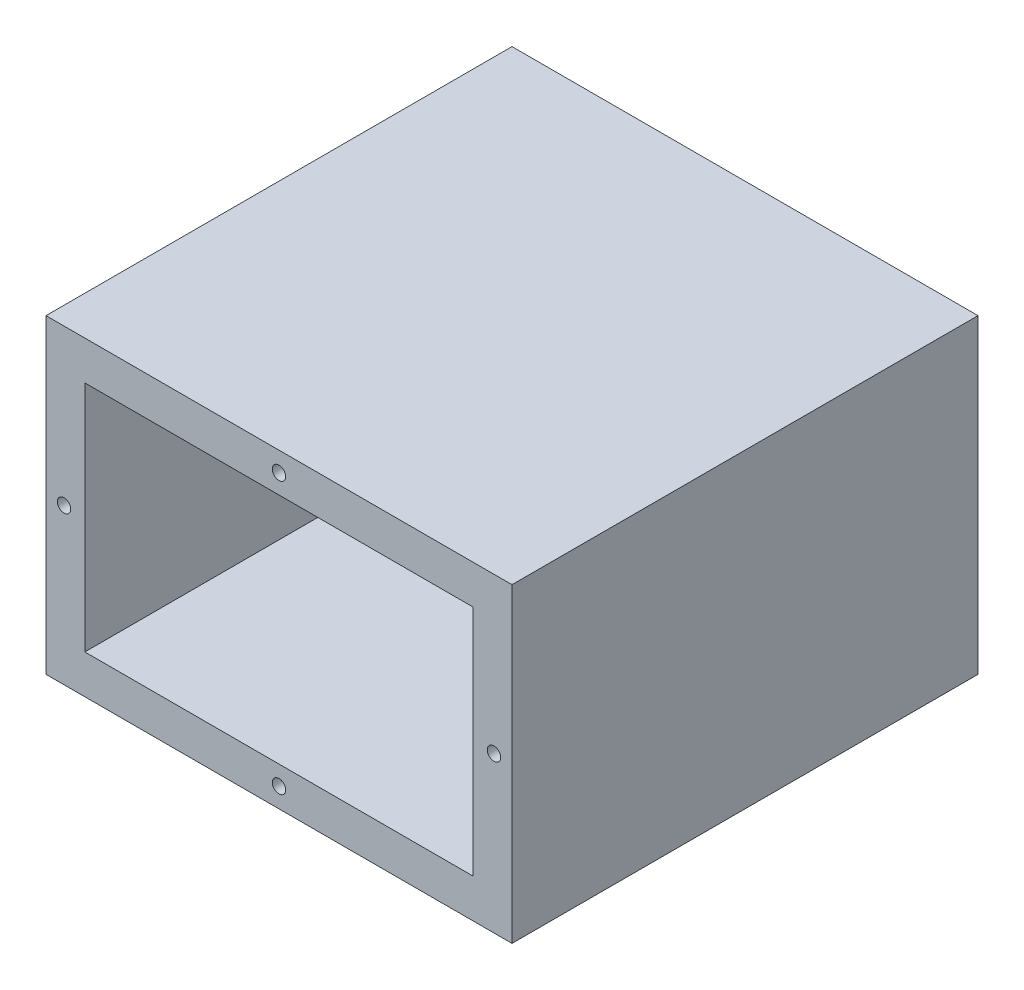
ISO-10303-21;
HEADER;
FILE_DESCRIPTION(('STEP AP214'),'2;1');
FILE_NAME('part.step','',(''),(''),'','','');
FILE_SCHEMA(('AUTOMOTIVE_DESIGN { 1 0 10303 214 1 1 1 1 }'));
ENDSEC;
DATA;
#1=APPLICATION_CONTEXT('core data for automotive mechanical design processes');
#2=APPLICATION_PROTOCOL_DEFINITION('international standard','automotive_design',2000,#1);
#3=PRODUCT_CONTEXT('',#1,'mechanical');
#4=PRODUCT('Part','Part','',(#3));
#5=PRODUCT_RELATED_PRODUCT_CATEGORY('part','',(#4));
#6=PRODUCT_DEFINITION_FORMATION('','',#4);
#7=PRODUCT_DEFINITION_CONTEXT('part definition',#1,'design');
#8=PRODUCT_DEFINITION('design','',#6,#7);
#9=PRODUCT_DEFINITION_SHAPE('','',#8);
#10=(LENGTH_UNIT() NAMED_UNIT(*) SI_UNIT(.MILLI.,.METRE.));
#11=(NAMED_UNIT(*) PLANE_ANGLE_UNIT() SI_UNIT($,.RADIAN.));
#12=(NAMED_UNIT(*) SI_UNIT($,.STERADIAN.) SOLID_ANGLE_UNIT());
#13=UNCERTAINTY_MEASURE_WITH_UNIT(LENGTH_MEASURE(1.E-05),#10,'distance_accuracy_value','');
#14=(GEOMETRIC_REPRESENTATION_CONTEXT(3) GLOBAL_UNCERTAINTY_ASSIGNED_CONTEXT((#13)) GLOBAL_UNIT_ASSIGNED_CONTEXT((#10,
#11,#12)) REPRESENTATION_CONTEXT('',''));
#15=CARTESIAN_POINT('',(0.,0.,0.));
#16=DIRECTION('',(0.,0.,1.));
#17=DIRECTION('',(1.,0.,0.));
#18=AXIS2_PLACEMENT_3D('',#15,#16,#17);
#19=CARTESIAN_POINT('',(-38.1,-25.4,76.2));
#20=DIRECTION('',(1.,0.,0.));
#21=DIRECTION('',(0.,0.,-1.));
#22=AXIS2_PLACEMENT_3D('',#19,#20,#21);
#23=PLANE('',#22);
#24=DIRECTION('',(0.,-1.,0.));
#25=VECTOR('',#24,1.);
#26=CARTESIAN_POINT('',(-38.1,-25.4,0.));
#27=LINE('',#26,#25);
#28=CARTESIAN_POINT('',(-38.1,25.4,0.));
#29=VERTEX_POINT('',#28);
#30=CARTESIAN_POINT('',(-38.1,-25.4,0.));
#31=VERTEX_POINT('',#30);
#32=EDGE_CURVE('E166',#29,#31,#27,.T.);
#33=ORIENTED_EDGE('',*,*,#32,.T.);
#34=DIRECTION('',(0.,0.,-1.));
#35=VECTOR('',#34,1.);
#36=CARTESIAN_POINT('',(-38.1,-25.4,76.2));
#37=LINE('',#36,#35);
#38=CARTESIAN_POINT('',(-38.1,-25.4,76.2));
#39=VERTEX_POINT('',#38);
#40=EDGE_CURVE('E11',#39,#31,#37,.T.);
#41=ORIENTED_EDGE('',*,*,#40,.F.);
#42=DIRECTION('',(0.,-1.,0.));
#43=VECTOR('',#42,1.);
#44=CARTESIAN_POINT('',(-38.1,-25.4,76.2));
#45=LINE('',#44,#43);
#46=CARTESIAN_POINT('',(-38.1,25.4,76.2));
#47=VERTEX_POINT('',#46);
#48=EDGE_CURVE('E175',#47,#39,#45,.T.);
#49=ORIENTED_EDGE('',*,*,#48,.F.);
#50=DIRECTION('',(0.,0.,-1.));
#51=VECTOR('',#50,1.);
#52=CARTESIAN_POINT('',(-38.1,25.4,76.2));
#53=LINE('',#52,#51);
#54=EDGE_CURVE('E183',#47,#29,#53,.T.);
#55=ORIENTED_EDGE('',*,*,#54,.T.);
#56=EDGE_LOOP('',(#33,#41,#49,#55));
#57=FACE_BOUND('',#56,.T.);
#58=ADVANCED_FACE('F44',(#57),#23,.F.);
#59=CARTESIAN_POINT('',(38.1,-25.4,76.2));
#60=DIRECTION('',(0.,1.,0.));
#61=DIRECTION('',(-1.,0.,0.));
#62=AXIS2_PLACEMENT_3D('',#59,#60,#61);
#63=PLANE('',#62);
#64=DIRECTION('',(1.,0.,0.));
#65=VECTOR('',#64,1.);
#66=CARTESIAN_POINT('',(38.1,-25.4,0.));
#67=LINE('',#66,#65);
#68=CARTESIAN_POINT('',(38.1,-25.4,0.));
#69=VERTEX_POINT('',#68);
#70=EDGE_CURVE('E188',#31,#69,#67,.T.);
#71=ORIENTED_EDGE('',*,*,#70,.T.);
#72=DIRECTION('',(0.,0.,-1.));
#73=VECTOR('',#72,1.);
#74=CARTESIAN_POINT('',(38.1,-25.4,76.2));
#75=LINE('',#74,#73);
#76=CARTESIAN_POINT('',(38.1,-25.4,76.2));
#77=VERTEX_POINT('',#76);
#78=EDGE_CURVE('E53',#77,#69,#75,.T.);
#79=ORIENTED_EDGE('',*,*,#78,.F.);
#80=DIRECTION('',(1.,0.,0.));
#81=VECTOR('',#80,1.);
#82=CARTESIAN_POINT('',(38.1,-25.4,76.2));
#83=LINE('',#82,#81);
#84=EDGE_CURVE('E97',#39,#77,#83,.T.);
#85=ORIENTED_EDGE('',*,*,#84,.F.);
#86=ORIENTED_EDGE('',*,*,#40,.T.);
#87=EDGE_LOOP('',(#71,#79,#85,#86));
#88=FACE_BOUND('',#87,.T.);
#89=ADVANCED_FACE('F279',(#88),#63,.F.);
#90=CARTESIAN_POINT('',(38.1,-25.4,76.2));
#91=DIRECTION('',(-1.,0.,0.));
#92=DIRECTION('',(0.,0.,1.));
#93=AXIS2_PLACEMENT_3D('',#90,#91,#92);
#94=PLANE('',#93);
#95=DIRECTION('',(0.,1.,0.));
#96=VECTOR('',#95,1.);
#97=CARTESIAN_POINT('',(38.1,-25.4,0.));
#98=LINE('',#97,#96);
#99=CARTESIAN_POINT('',(38.1,25.4,0.));
#100=VERTEX_POINT('',#99);
#101=EDGE_CURVE('E194',#69,#100,#98,.T.);
#102=ORIENTED_EDGE('',*,*,#101,.T.);
#103=DIRECTION('',(0.,0.,-1.));
#104=VECTOR('',#103,1.);
#105=CARTESIAN_POINT('',(38.1,25.4,76.2));
#106=LINE('',#105,#104);
#107=CARTESIAN_POINT('',(38.1,25.4,76.2));
#108=VERTEX_POINT('',#107);
#109=EDGE_CURVE('E200',#108,#100,#106,.T.);
#110=ORIENTED_EDGE('',*,*,#109,.F.);
#111=DIRECTION('',(0.,1.,0.));
#112=VECTOR('',#111,1.);
#113=CARTESIAN_POINT('',(38.1,-25.4,76.2));
#114=LINE('',#113,#112);
#115=EDGE_CURVE('E178',#77,#108,#114,.T.);
#116=ORIENTED_EDGE('',*,*,#115,.F.);
#117=ORIENTED_EDGE('',*,*,#78,.T.);
#118=EDGE_LOOP('',(#102,#110,#116,#117));
#119=FACE_BOUND('',#118,.T.);
#120=ADVANCED_FACE('F284',(#119),#94,.F.);
#121=CARTESIAN_POINT('',(38.1,25.4,76.2));
#122=DIRECTION('',(0.,-1.,0.));
#123=DIRECTION('',(1.,0.,0.));
#124=AXIS2_PLACEMENT_3D('',#121,#122,#123);
#125=PLANE('',#124);
#126=DIRECTION('',(-1.,0.,0.));
#127=VECTOR('',#126,1.);
#128=CARTESIAN_POINT('',(38.1,25.4,0.));
#129=LINE('',#128,#127);
#130=EDGE_CURVE('E95',#100,#29,#129,.T.);
#131=ORIENTED_EDGE('',*,*,#130,.T.);
#132=ORIENTED_EDGE('',*,*,#54,.F.);
#133=DIRECTION('',(-1.,0.,0.));
#134=VECTOR('',#133,1.);
#135=CARTESIAN_POINT('',(38.1,25.4,76.2));
#136=LINE('',#135,#134);
#137=EDGE_CURVE('E72',#108,#47,#136,.T.);
#138=ORIENTED_EDGE('',*,*,#137,.F.);
#139=ORIENTED_EDGE('',*,*,#109,.T.);
#140=EDGE_LOOP('',(#131,#132,#138,#139));
#141=FACE_BOUND('',#140,.T.);
#142=ADVANCED_FACE('F264',(#141),#125,.F.);
#143=CARTESIAN_POINT('',(0.,0.,76.2));
#144=DIRECTION('',(0.,0.,1.));
#145=DIRECTION('',(1.,0.,0.));
#146=AXIS2_PLACEMENT_3D('',#143,#144,#145);
#147=PLANE('',#146);
#148=CARTESIAN_POINT('',(-35.1498353727456,0.,76.2));
#149=DIRECTION('',(0.,0.,1.));
#150=DIRECTION('',(1.,0.,0.));
#151=AXIS2_PLACEMENT_3D('',#148,#149,#150);
#152=CIRCLE('',#151,1.0922);
#153=CARTESIAN_POINT('',(-34.0576353727456,0.,76.2));
#154=VERTEX_POINT('',#153);
#155=EDGE_CURVE('E243',#154,#154,#152,.T.);
#156=ORIENTED_EDGE('',*,*,#155,.F.);
#157=EDGE_LOOP('',(#156));
#158=FACE_BOUND('',#157,.T.);
#159=CARTESIAN_POINT('',(35.1498353727456,0.,76.2));
#160=DIRECTION('',(0.,0.,1.));
#161=DIRECTION('',(-1.,0.,0.));
#162=AXIS2_PLACEMENT_3D('',#159,#160,#161);
#163=CIRCLE('',#162,1.0922);
#164=CARTESIAN_POINT('',(34.0576353727456,0.,76.2));
#165=VERTEX_POINT('',#164);
#166=EDGE_CURVE('E238',#165,#165,#163,.T.);
#167=ORIENTED_EDGE('',*,*,#166,.F.);
#168=EDGE_LOOP('',(#167));
#169=FACE_BOUND('',#168,.T.);
#170=CARTESIAN_POINT('',(0.,22.1865179883757,76.2));
#171=DIRECTION('',(0.,0.,1.));
#172=DIRECTION('',(1.,0.,0.));
#173=AXIS2_PLACEMENT_3D('',#170,#171,#172);
#174=CIRCLE('',#173,1.0922);
#175=CARTESIAN_POINT('',(1.09220000000001,22.1865179883757,76.2));
#176=VERTEX_POINT('',#175);
#177=EDGE_CURVE('E234',#176,#176,#174,.T.);
#178=ORIENTED_EDGE('',*,*,#177,.F.);
#179=EDGE_LOOP('',(#178));
#180=FACE_BOUND('',#179,.T.);
#181=CARTESIAN_POINT('',(0.,-22.1865179883758,76.2));
#182=DIRECTION('',(0.,0.,1.));
#183=DIRECTION('',(-1.,0.,0.));
#184=AXIS2_PLACEMENT_3D('',#181,#182,#183);
#185=CIRCLE('',#184,1.0922);
#186=CARTESIAN_POINT('',(-1.09220000000002,-22.1865179883758,76.2));
#187=VERTEX_POINT('',#186);
#188=EDGE_CURVE('E221',#187,#187,#185,.T.);
#189=ORIENTED_EDGE('',*,*,#188,.F.);
#190=EDGE_LOOP('',(#189));
#191=FACE_BOUND('',#190,.T.);
#192=DIRECTION('',(0.,-1.,0.));
#193=VECTOR('',#192,1.);
#194=CARTESIAN_POINT('',(-31.75,-19.05,76.2));
#195=LINE('',#194,#193);
#196=CARTESIAN_POINT('',(-31.75,19.05,76.2));
#197=VERTEX_POINT('',#196);
#198=CARTESIAN_POINT('',(-31.75,-19.05,76.2));
#199=VERTEX_POINT('',#198);
#200=EDGE_CURVE('E62',#197,#199,#195,.T.);
#201=ORIENTED_EDGE('',*,*,#200,.F.);
#202=DIRECTION('',(-1.,0.,0.));
#203=VECTOR('',#202,1.);
#204=CARTESIAN_POINT('',(31.75,19.05,76.2));
#205=LINE('',#204,#203);
#206=CARTESIAN_POINT('',(31.75,19.05,76.2));
#207=VERTEX_POINT('',#206);
#208=EDGE_CURVE('E145',#207,#197,#205,.T.);
#209=ORIENTED_EDGE('',*,*,#208,.F.);
#210=DIRECTION('',(0.,1.,0.));
#211=VECTOR('',#210,1.);
#212=CARTESIAN_POINT('',(31.75,-19.05,76.2));
#213=LINE('',#212,#211);
#214=CARTESIAN_POINT('',(31.75,-19.05,76.2));
#215=VERTEX_POINT('',#214);
#216=EDGE_CURVE('E146',#215,#207,#213,.T.);
#217=ORIENTED_EDGE('',*,*,#216,.F.);
#218=DIRECTION('',(1.,0.,0.));
#219=VECTOR('',#218,1.);
#220=CARTESIAN_POINT('',(31.75,-19.05,76.2));
#221=LINE('',#220,#219);
#222=EDGE_CURVE('E159',#199,#215,#221,.T.);
#223=ORIENTED_EDGE('',*,*,#222,.F.);
#224=EDGE_LOOP('',(#201,#209,#217,#223));
#225=FACE_BOUND('',#224,.T.);
#226=ORIENTED_EDGE('',*,*,#48,.T.);
#227=ORIENTED_EDGE('',*,*,#84,.T.);
#228=ORIENTED_EDGE('',*,*,#115,.T.);
#229=ORIENTED_EDGE('',*,*,#137,.T.);
#230=EDGE_LOOP('',(#226,#227,#228,#229));
#231=FACE_BOUND('',#230,.T.);
#232=ADVANCED_FACE('F261',(#158,#169,#180,#191,#225,#231),#147,.T.);
#233=CARTESIAN_POINT('',(0.,0.,0.));
#234=DIRECTION('',(0.,0.,1.));
#235=DIRECTION('',(1.,0.,0.));
#236=AXIS2_PLACEMENT_3D('',#233,#234,#235);
#237=PLANE('',#236);
#238=CARTESIAN_POINT('',(0.,0.,0.));
#239=DIRECTION('',(0.,0.,1.));
#240=DIRECTION('',(1.,0.,0.));
#241=AXIS2_PLACEMENT_3D('',#238,#239,#240);
#242=CIRCLE('',#241,3.175);
#243=CARTESIAN_POINT('',(3.175,0.,0.));
#244=VERTEX_POINT('',#243);
#245=EDGE_CURVE('E48',#244,#244,#242,.T.);
#246=ORIENTED_EDGE('',*,*,#245,.T.);
#247=EDGE_LOOP('',(#246));
#248=FACE_BOUND('',#247,.T.);
#249=CARTESIAN_POINT('',(-16.51,0.,0.));
#250=DIRECTION('',(0.,0.,1.));
#251=DIRECTION('',(1.,0.,0.));
#252=AXIS2_PLACEMENT_3D('',#249,#250,#251);
#253=CIRCLE('',#252,1.651);
#254=CARTESIAN_POINT('',(-14.859,0.,0.));
#255=VERTEX_POINT('',#254);
#256=EDGE_CURVE('E204',#255,#255,#253,.T.);
#257=ORIENTED_EDGE('',*,*,#256,.T.);
#258=EDGE_LOOP('',(#257));
#259=FACE_BOUND('',#258,.T.);
#260=ORIENTED_EDGE('',*,*,#32,.F.);
#261=ORIENTED_EDGE('',*,*,#130,.F.);
#262=ORIENTED_EDGE('',*,*,#101,.F.);
#263=ORIENTED_EDGE('',*,*,#70,.F.);
#264=EDGE_LOOP('',(#260,#261,#262,#263));
#265=FACE_BOUND('',#264,.T.);
#266=ADVANCED_FACE('F262',(#248,#259,#265),#237,.F.);
#267=CARTESIAN_POINT('',(-31.75,-19.05,5.07999999999997));
#268=DIRECTION('',(-1.,0.,0.));
#269=DIRECTION('',(0.,0.,1.));
#270=AXIS2_PLACEMENT_3D('',#267,#268,#269);
#271=PLANE('',#270);
#272=ORIENTED_EDGE('',*,*,#200,.T.);
#273=DIRECTION('',(0.,0.,1.));
#274=VECTOR('',#273,1.);
#275=CARTESIAN_POINT('',(-31.75,-19.05,5.07999999999997));
#276=LINE('',#275,#274);
#277=CARTESIAN_POINT('',(-31.75,-19.05,5.07999999999997));
#278=VERTEX_POINT('',#277);
#279=EDGE_CURVE('E118',#278,#199,#276,.T.);
#280=ORIENTED_EDGE('',*,*,#279,.F.);
#281=DIRECTION('',(0.,-1.,0.));
#282=VECTOR('',#281,1.);
#283=CARTESIAN_POINT('',(-31.75,-19.05,5.07999999999997));
#284=LINE('',#283,#282);
#285=CARTESIAN_POINT('',(-31.75,19.05,5.07999999999997));
#286=VERTEX_POINT('',#285);
#287=EDGE_CURVE('E125',#286,#278,#284,.T.);
#288=ORIENTED_EDGE('',*,*,#287,.F.);
#289=DIRECTION('',(0.,0.,1.));
#290=VECTOR('',#289,1.);
#291=CARTESIAN_POINT('',(-31.75,19.05,5.07999999999997));
#292=LINE('',#291,#290);
#293=EDGE_CURVE('E167',#286,#197,#292,.T.);
#294=ORIENTED_EDGE('',*,*,#293,.T.);
#295=EDGE_LOOP('',(#272,#280,#288,#294));
#296=FACE_BOUND('',#295,.T.);
#297=ADVANCED_FACE('F122',(#296),#271,.F.);
#298=CARTESIAN_POINT('',(31.75,19.05,5.07999999999997));
#299=DIRECTION('',(0.,1.,0.));
#300=DIRECTION('',(0.,0.,1.));
#301=AXIS2_PLACEMENT_3D('',#298,#299,#300);
#302=PLANE('',#301);
#303=ORIENTED_EDGE('',*,*,#208,.T.);
#304=ORIENTED_EDGE('',*,*,#293,.F.);
#305=DIRECTION('',(-1.,0.,0.));
#306=VECTOR('',#305,1.);
#307=CARTESIAN_POINT('',(31.75,19.05,5.07999999999997));
#308=LINE('',#307,#306);
#309=CARTESIAN_POINT('',(31.75,19.05,5.07999999999997));
#310=VERTEX_POINT('',#309);
#311=EDGE_CURVE('E128',#310,#286,#308,.T.);
#312=ORIENTED_EDGE('',*,*,#311,.F.);
#313=DIRECTION('',(0.,0.,1.));
#314=VECTOR('',#313,1.);
#315=CARTESIAN_POINT('',(31.75,19.05,5.07999999999997));
#316=LINE('',#315,#314);
#317=EDGE_CURVE('E168',#310,#207,#316,.T.);
#318=ORIENTED_EDGE('',*,*,#317,.T.);
#319=EDGE_LOOP('',(#303,#304,#312,#318));
#320=FACE_BOUND('',#319,.T.);
#321=ADVANCED_FACE('F291',(#320),#302,.F.);
#322=CARTESIAN_POINT('',(31.75,-19.05,5.07999999999997));
#323=DIRECTION('',(1.,0.,0.));
#324=DIRECTION('',(0.,0.,-1.));
#325=AXIS2_PLACEMENT_3D('',#322,#323,#324);
#326=PLANE('',#325);
#327=ORIENTED_EDGE('',*,*,#216,.T.);
#328=ORIENTED_EDGE('',*,*,#317,.F.);
#329=DIRECTION('',(0.,1.,0.));
#330=VECTOR('',#329,1.);
#331=CARTESIAN_POINT('',(31.75,-19.05,5.07999999999997));
#332=LINE('',#331,#330);
#333=CARTESIAN_POINT('',(31.75,-19.05,5.07999999999997));
#334=VERTEX_POINT('',#333);
#335=EDGE_CURVE('E136',#334,#310,#332,.T.);
#336=ORIENTED_EDGE('',*,*,#335,.F.);
#337=DIRECTION('',(0.,0.,1.));
#338=VECTOR('',#337,1.);
#339=CARTESIAN_POINT('',(31.75,-19.05,5.07999999999997));
#340=LINE('',#339,#338);
#341=EDGE_CURVE('E129',#334,#215,#340,.T.);
#342=ORIENTED_EDGE('',*,*,#341,.T.);
#343=EDGE_LOOP('',(#327,#328,#336,#342));
#344=FACE_BOUND('',#343,.T.);
#345=ADVANCED_FACE('F325',(#344),#326,.F.);
#346=CARTESIAN_POINT('',(31.75,-19.05,5.07999999999997));
#347=DIRECTION('',(0.,-1.,0.));
#348=DIRECTION('',(0.,0.,-1.));
#349=AXIS2_PLACEMENT_3D('',#346,#347,#348);
#350=PLANE('',#349);
#351=ORIENTED_EDGE('',*,*,#222,.T.);
#352=ORIENTED_EDGE('',*,*,#341,.F.);
#353=DIRECTION('',(1.,0.,0.));
#354=VECTOR('',#353,1.);
#355=CARTESIAN_POINT('',(31.75,-19.05,5.07999999999997));
#356=LINE('',#355,#354);
#357=EDGE_CURVE('E134',#278,#334,#356,.T.);
#358=ORIENTED_EDGE('',*,*,#357,.F.);
#359=ORIENTED_EDGE('',*,*,#279,.T.);
#360=EDGE_LOOP('',(#351,#352,#358,#359));
#361=FACE_BOUND('',#360,.T.);
#362=ADVANCED_FACE('F133',(#361),#350,.F.);
#363=CARTESIAN_POINT('',(0.,0.,5.07999999999997));
#364=DIRECTION('',(0.,0.,1.));
#365=DIRECTION('',(1.,0.,0.));
#366=AXIS2_PLACEMENT_3D('',#363,#364,#365);
#367=PLANE('',#366);
#368=CARTESIAN_POINT('',(0.,0.,5.07999999999997));
#369=DIRECTION('',(0.,0.,1.));
#370=DIRECTION('',(1.,0.,0.));
#371=AXIS2_PLACEMENT_3D('',#368,#369,#370);
#372=CIRCLE('',#371,3.175);
#373=CARTESIAN_POINT('',(3.175,0.,5.07999999999997));
#374=VERTEX_POINT('',#373);
#375=EDGE_CURVE('E210',#374,#374,#372,.T.);
#376=ORIENTED_EDGE('',*,*,#375,.F.);
#377=EDGE_LOOP('',(#376));
#378=FACE_BOUND('',#377,.T.);
#379=CARTESIAN_POINT('',(-16.51,0.,5.07999999999997));
#380=DIRECTION('',(0.,0.,1.));
#381=DIRECTION('',(1.,0.,0.));
#382=AXIS2_PLACEMENT_3D('',#379,#380,#381);
#383=CIRCLE('',#382,1.651);
#384=CARTESIAN_POINT('',(-14.859,0.,5.07999999999997));
#385=VERTEX_POINT('',#384);
#386=EDGE_CURVE('E151',#385,#385,#383,.T.);
#387=ORIENTED_EDGE('',*,*,#386,.F.);
#388=EDGE_LOOP('',(#387));
#389=FACE_BOUND('',#388,.T.);
#390=ORIENTED_EDGE('',*,*,#287,.T.);
#391=ORIENTED_EDGE('',*,*,#357,.T.);
#392=ORIENTED_EDGE('',*,*,#335,.T.);
#393=ORIENTED_EDGE('',*,*,#311,.T.);
#394=EDGE_LOOP('',(#390,#391,#392,#393));
#395=FACE_BOUND('',#394,.T.);
#396=ADVANCED_FACE('F143',(#378,#389,#395),#367,.T.);
#397=CARTESIAN_POINT('',(-16.51,0.,-43.1800000000001));
#398=DIRECTION('',(0.,0.,1.));
#399=DIRECTION('',(1.,0.,0.));
#400=AXIS2_PLACEMENT_3D('',#397,#398,#399);
#401=CYLINDRICAL_SURFACE('',#400,1.651);
#402=ORIENTED_EDGE('',*,*,#386,.T.);
#403=EDGE_LOOP('',(#402));
#404=FACE_BOUND('',#403,.T.);
#405=ORIENTED_EDGE('',*,*,#256,.F.);
#406=EDGE_LOOP('',(#405));
#407=FACE_BOUND('',#406,.T.);
#408=ADVANCED_FACE('F350',(#404,#407),#401,.F.);
#409=CARTESIAN_POINT('',(0.,0.,-43.1800000000001));
#410=DIRECTION('',(0.,0.,1.));
#411=DIRECTION('',(1.,0.,0.));
#412=AXIS2_PLACEMENT_3D('',#409,#410,#411);
#413=CYLINDRICAL_SURFACE('',#412,3.175);
#414=ORIENTED_EDGE('',*,*,#375,.T.);
#415=EDGE_LOOP('',(#414));
#416=FACE_BOUND('',#415,.T.);
#417=ORIENTED_EDGE('',*,*,#245,.F.);
#418=EDGE_LOOP('',(#417));
#419=FACE_BOUND('',#418,.T.);
#420=ADVANCED_FACE('F359',(#416,#419),#413,.F.);
#421=CARTESIAN_POINT('',(0.,-22.1865179883758,60.325));
#422=DIRECTION('',(0.,0.,1.));
#423=DIRECTION('',(1.,0.,0.));
#424=AXIS2_PLACEMENT_3D('',#421,#422,#423);
#425=CYLINDRICAL_SURFACE('',#424,1.0922);
#426=CARTESIAN_POINT('',(0.,-22.1865179883758,60.325));
#427=DIRECTION('',(0.,0.,1.));
#428=DIRECTION('',(-1.,0.,0.));
#429=AXIS2_PLACEMENT_3D('',#426,#427,#428);
#430=CIRCLE('',#429,1.0922);
#431=CARTESIAN_POINT('',(-1.09220000000002,-22.1865179883758,60.325));
#432=VERTEX_POINT('',#431);
#433=EDGE_CURVE('E219',#432,#432,#430,.T.);
#434=ORIENTED_EDGE('',*,*,#433,.F.);
#435=EDGE_LOOP('',(#434));
#436=FACE_BOUND('',#435,.T.);
#437=ORIENTED_EDGE('',*,*,#188,.T.);
#438=EDGE_LOOP('',(#437));
#439=FACE_BOUND('',#438,.T.);
#440=ADVANCED_FACE('F370',(#436,#439),#425,.F.);
#441=CARTESIAN_POINT('',(0.,-22.1865179883758,60.325));
#442=DIRECTION('',(0.,0.,-1.));
#443=DIRECTION('',(-1.,0.,0.));
#444=AXIS2_PLACEMENT_3D('',#441,#442,#443);
#445=PLANE('',#444);
#446=ORIENTED_EDGE('',*,*,#433,.T.);
#447=EDGE_LOOP('',(#446));
#448=FACE_BOUND('',#447,.T.);
#449=ADVANCED_FACE('F376',(#448),#445,.F.);
#450=CARTESIAN_POINT('',(0.,22.1865179883757,60.325));
#451=DIRECTION('',(0.,0.,1.));
#452=DIRECTION('',(1.,0.,0.));
#453=AXIS2_PLACEMENT_3D('',#450,#451,#452);
#454=CYLINDRICAL_SURFACE('',#453,1.0922);
#455=CARTESIAN_POINT('',(0.,22.1865179883757,60.325));
#456=DIRECTION('',(0.,0.,1.));
#457=DIRECTION('',(1.,0.,0.));
#458=AXIS2_PLACEMENT_3D('',#455,#456,#457);
#459=CIRCLE('',#458,1.0922);
#460=CARTESIAN_POINT('',(1.09220000000001,22.1865179883757,60.325));
#461=VERTEX_POINT('',#460);
#462=EDGE_CURVE('E229',#461,#461,#459,.T.);
#463=ORIENTED_EDGE('',*,*,#462,.F.);
#464=EDGE_LOOP('',(#463));
#465=FACE_BOUND('',#464,.T.);
#466=ORIENTED_EDGE('',*,*,#177,.T.);
#467=EDGE_LOOP('',(#466));
#468=FACE_BOUND('',#467,.T.);
#469=ADVANCED_FACE('F387',(#465,#468),#454,.F.);
#470=CARTESIAN_POINT('',(0.,22.1865179883757,60.325));
#471=DIRECTION('',(0.,0.,1.));
#472=DIRECTION('',(1.,0.,0.));
#473=AXIS2_PLACEMENT_3D('',#470,#471,#472);
#474=PLANE('',#473);
#475=ORIENTED_EDGE('',*,*,#462,.T.);
#476=EDGE_LOOP('',(#475));
#477=FACE_BOUND('',#476,.T.);
#478=ADVANCED_FACE('F397',(#477),#474,.T.);
#479=CARTESIAN_POINT('',(35.1498353727456,0.,60.325));
#480=DIRECTION('',(0.,0.,1.));
#481=DIRECTION('',(1.,0.,0.));
#482=AXIS2_PLACEMENT_3D('',#479,#480,#481);
#483=CYLINDRICAL_SURFACE('',#482,1.0922);
#484=CARTESIAN_POINT('',(35.1498353727456,0.,60.325));
#485=DIRECTION('',(0.,0.,1.));
#486=DIRECTION('',(-1.,0.,0.));
#487=AXIS2_PLACEMENT_3D('',#484,#485,#486);
#488=CIRCLE('',#487,1.0922);
#489=CARTESIAN_POINT('',(34.0576353727456,0.,60.325));
#490=VERTEX_POINT('',#489);
#491=EDGE_CURVE('E237',#490,#490,#488,.T.);
#492=ORIENTED_EDGE('',*,*,#491,.F.);
#493=EDGE_LOOP('',(#492));
#494=FACE_BOUND('',#493,.T.);
#495=ORIENTED_EDGE('',*,*,#166,.T.);
#496=EDGE_LOOP('',(#495));
#497=FACE_BOUND('',#496,.T.);
#498=ADVANCED_FACE('F406',(#494,#497),#483,.F.);
#499=CARTESIAN_POINT('',(35.1498353727456,0.,60.325));
#500=DIRECTION('',(0.,0.,-1.));
#501=DIRECTION('',(-1.,0.,0.));
#502=AXIS2_PLACEMENT_3D('',#499,#500,#501);
#503=PLANE('',#502);
#504=ORIENTED_EDGE('',*,*,#491,.T.);
#505=EDGE_LOOP('',(#504));
#506=FACE_BOUND('',#505,.T.);
#507=ADVANCED_FACE('F260',(#506),#503,.F.);
#508=CARTESIAN_POINT('',(-35.1498353727456,0.,60.325));
#509=DIRECTION('',(0.,0.,1.));
#510=DIRECTION('',(1.,0.,0.));
#511=AXIS2_PLACEMENT_3D('',#508,#509,#510);
#512=CYLINDRICAL_SURFACE('',#511,1.0922);
#513=CARTESIAN_POINT('',(-35.1498353727456,0.,60.325));
#514=DIRECTION('',(0.,0.,1.));
#515=DIRECTION('',(1.,0.,0.));
#516=AXIS2_PLACEMENT_3D('',#513,#514,#515);
#517=CIRCLE('',#516,1.0922);
#518=CARTESIAN_POINT('',(-34.0576353727456,0.,60.325));
#519=VERTEX_POINT('',#518);
#520=EDGE_CURVE('E217',#519,#519,#517,.T.);
#521=ORIENTED_EDGE('',*,*,#520,.F.);
#522=EDGE_LOOP('',(#521));
#523=FACE_BOUND('',#522,.T.);
#524=ORIENTED_EDGE('',*,*,#155,.T.);
#525=EDGE_LOOP('',(#524));
#526=FACE_BOUND('',#525,.T.);
#527=ADVANCED_FACE('F255',(#523,#526),#512,.F.);
#528=CARTESIAN_POINT('',(-35.1498353727456,0.,60.325));
#529=DIRECTION('',(0.,0.,1.));
#530=DIRECTION('',(1.,0.,0.));
#531=AXIS2_PLACEMENT_3D('',#528,#529,#530);
#532=PLANE('',#531);
#533=ORIENTED_EDGE('',*,*,#520,.T.);
#534=EDGE_LOOP('',(#533));
#535=FACE_BOUND('',#534,.T.);
#536=ADVANCED_FACE('F252',(#535),#532,.T.);
#537=CLOSED_SHELL('',(#58,#89,#120,#142,#232,#266,#297,#321,#345,#362,#396,#408,#420,#440,#449,
#469,#478,#498,#507,#527,#536));
#538=MANIFOLD_SOLID_BREP('B2',#537);
#539=ADVANCED_BREP_SHAPE_REPRESENTATION('',(#18,#538),#14);
#540=SHAPE_DEFINITION_REPRESENTATION(#9,#539);
ENDSEC;
END-ISO-10303-21;
